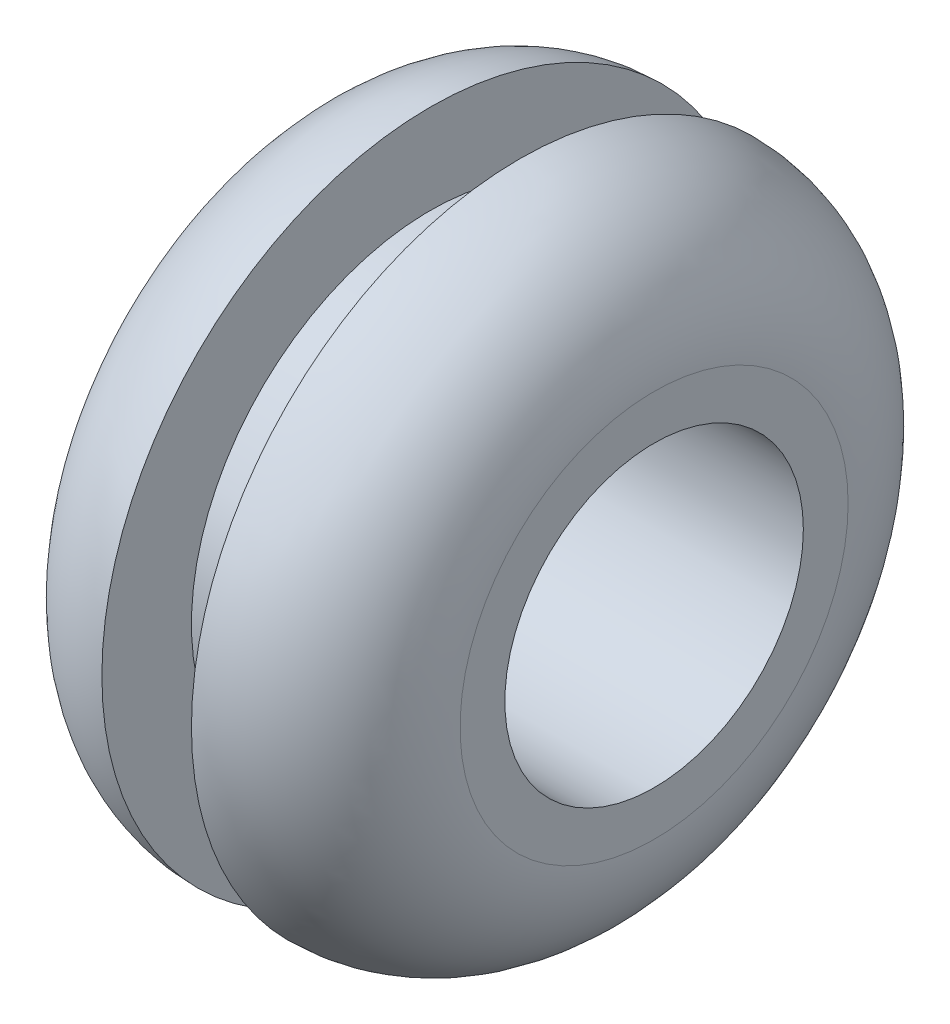
ISO-10303-21;
HEADER;
FILE_DESCRIPTION(('STEP AP214'),'2;1');
FILE_NAME('part.step','',(''),(''),'','','');
FILE_SCHEMA(('AUTOMOTIVE_DESIGN { 1 0 10303 214 1 1 1 1 }'));
ENDSEC;
DATA;
#1=APPLICATION_CONTEXT('core data for automotive mechanical design processes');
#2=APPLICATION_PROTOCOL_DEFINITION('international standard','automotive_design',2000,#1);
#3=PRODUCT_CONTEXT('',#1,'mechanical');
#4=PRODUCT('Part','Part','',(#3));
#5=PRODUCT_RELATED_PRODUCT_CATEGORY('part','',(#4));
#6=PRODUCT_DEFINITION_FORMATION('','',#4);
#7=PRODUCT_DEFINITION_CONTEXT('part definition',#1,'design');
#8=PRODUCT_DEFINITION('design','',#6,#7);
#9=PRODUCT_DEFINITION_SHAPE('','',#8);
#10=(LENGTH_UNIT() NAMED_UNIT(*) SI_UNIT(.MILLI.,.METRE.));
#11=(NAMED_UNIT(*) PLANE_ANGLE_UNIT() SI_UNIT($,.RADIAN.));
#12=(NAMED_UNIT(*) SI_UNIT($,.STERADIAN.) SOLID_ANGLE_UNIT());
#13=UNCERTAINTY_MEASURE_WITH_UNIT(LENGTH_MEASURE(1.E-05),#10,'distance_accuracy_value','');
#14=(GEOMETRIC_REPRESENTATION_CONTEXT(3) GLOBAL_UNCERTAINTY_ASSIGNED_CONTEXT((#13)) GLOBAL_UNIT_ASSIGNED_CONTEXT((#10,
#11,#12)) REPRESENTATION_CONTEXT('',''));
#15=CARTESIAN_POINT('',(0.,0.,0.));
#16=DIRECTION('',(0.,0.,1.));
#17=DIRECTION('',(1.,0.,0.));
#18=AXIS2_PLACEMENT_3D('',#15,#16,#17);
#19=CARTESIAN_POINT('',(-27.9934163169552,5.49999999999999,0.));
#20=DIRECTION('',(-1.,0.,0.));
#21=DIRECTION('',(0.,0.,1.));
#22=AXIS2_PLACEMENT_3D('',#19,#20,#21);
#23=PLANE('',#22);
#24=CARTESIAN_POINT('',(-27.9934163169552,0.,0.));
#25=DIRECTION('',(-1.,0.,0.));
#26=DIRECTION('',(0.,0.,1.));
#27=AXIS2_PLACEMENT_3D('',#24,#25,#26);
#28=CIRCLE('',#27,3.24999999999999);
#29=CARTESIAN_POINT('',(-27.9934163169552,0.,3.24999999999999));
#30=VERTEX_POINT('',#29);
#31=EDGE_CURVE('E10',#30,#30,#28,.T.);
#32=ORIENTED_EDGE('',*,*,#31,.T.);
#33=EDGE_LOOP('',(#32));
#34=FACE_BOUND('',#33,.T.);
#35=CARTESIAN_POINT('',(-27.9934163169552,0.,0.));
#36=DIRECTION('',(1.,0.,0.));
#37=DIRECTION('',(0.,0.,-1.));
#38=AXIS2_PLACEMENT_3D('',#35,#36,#37);
#39=CIRCLE('',#38,2.49999999999999);
#40=CARTESIAN_POINT('',(-27.9934163169552,0.,-2.49999999999999));
#41=VERTEX_POINT('',#40);
#42=EDGE_CURVE('E41',#41,#41,#39,.T.);
#43=ORIENTED_EDGE('',*,*,#42,.T.);
#44=EDGE_LOOP('',(#43));
#45=FACE_BOUND('',#44,.T.);
#46=ADVANCED_FACE('F30',(#34,#45),#23,.T.);
#47=CARTESIAN_POINT('',(24.6068051669873,0.,0.));
#48=DIRECTION('',(1.,0.,0.));
#49=DIRECTION('',(0.,0.,-1.));
#50=AXIS2_PLACEMENT_3D('',#47,#48,#49);
#51=CYLINDRICAL_SURFACE('',#50,2.49999999999999);
#52=CARTESIAN_POINT('',(-21.9934163169552,0.,0.));
#53=DIRECTION('',(1.,0.,0.));
#54=DIRECTION('',(0.,0.,-1.));
#55=AXIS2_PLACEMENT_3D('',#52,#53,#54);
#56=CIRCLE('',#55,2.49999999999999);
#57=CARTESIAN_POINT('',(-21.9934163169552,0.,-2.49999999999999));
#58=VERTEX_POINT('',#57);
#59=EDGE_CURVE('E45',#58,#58,#56,.T.);
#60=ORIENTED_EDGE('',*,*,#59,.T.);
#61=EDGE_LOOP('',(#60));
#62=FACE_BOUND('',#61,.T.);
#63=ORIENTED_EDGE('',*,*,#42,.F.);
#64=EDGE_LOOP('',(#63));
#65=FACE_BOUND('',#64,.T.);
#66=ADVANCED_FACE('F74',(#62,#65),#51,.F.);
#67=CARTESIAN_POINT('',(-21.9934163169552,2.49999999999999,0.));
#68=DIRECTION('',(1.,0.,0.));
#69=DIRECTION('',(0.,0.,-1.));
#70=AXIS2_PLACEMENT_3D('',#67,#68,#69);
#71=PLANE('',#70);
#72=CARTESIAN_POINT('',(-21.9934163169552,0.,0.));
#73=DIRECTION('',(1.,0.,0.));
#74=DIRECTION('',(0.,0.,-1.));
#75=AXIS2_PLACEMENT_3D('',#72,#73,#74);
#76=CIRCLE('',#75,3.25);
#77=CARTESIAN_POINT('',(-21.9934163169552,0.,-3.25));
#78=VERTEX_POINT('',#77);
#79=EDGE_CURVE('E37',#78,#78,#76,.T.);
#80=ORIENTED_EDGE('',*,*,#79,.T.);
#81=EDGE_LOOP('',(#80));
#82=FACE_BOUND('',#81,.T.);
#83=ORIENTED_EDGE('',*,*,#59,.F.);
#84=EDGE_LOOP('',(#83));
#85=FACE_BOUND('',#84,.T.);
#86=ADVANCED_FACE('F79',(#82,#85),#71,.T.);
#87=CARTESIAN_POINT('',(-24.2434163169552,5.5,0.));
#88=DIRECTION('',(-1.,0.,0.));
#89=DIRECTION('',(0.,0.,1.));
#90=AXIS2_PLACEMENT_3D('',#87,#88,#89);
#91=PLANE('',#90);
#92=CARTESIAN_POINT('',(-24.2434163169552,0.,0.));
#93=DIRECTION('',(1.,0.,0.));
#94=DIRECTION('',(0.,0.,-1.));
#95=AXIS2_PLACEMENT_3D('',#92,#93,#94);
#96=CIRCLE('',#95,3.99999999999999);
#97=CARTESIAN_POINT('',(-24.2434163169552,0.,-3.99999999999999));
#98=VERTEX_POINT('',#97);
#99=EDGE_CURVE('E53',#98,#98,#96,.T.);
#100=ORIENTED_EDGE('',*,*,#99,.T.);
#101=EDGE_LOOP('',(#100));
#102=FACE_BOUND('',#101,.T.);
#103=CARTESIAN_POINT('',(-24.2434163169552,0.,0.));
#104=DIRECTION('',(1.,0.,0.));
#105=DIRECTION('',(0.,0.,-1.));
#106=AXIS2_PLACEMENT_3D('',#103,#104,#105);
#107=CIRCLE('',#106,5.5);
#108=CARTESIAN_POINT('',(-24.2434163169552,0.,-5.5));
#109=VERTEX_POINT('',#108);
#110=EDGE_CURVE('E50',#109,#109,#107,.T.);
#111=ORIENTED_EDGE('',*,*,#110,.F.);
#112=EDGE_LOOP('',(#111));
#113=FACE_BOUND('',#112,.T.);
#114=ADVANCED_FACE('F86',(#102,#113),#91,.T.);
#115=CARTESIAN_POINT('',(24.6068051669873,0.,0.));
#116=DIRECTION('',(1.,0.,0.));
#117=DIRECTION('',(0.,0.,-1.));
#118=AXIS2_PLACEMENT_3D('',#115,#116,#117);
#119=CYLINDRICAL_SURFACE('',#118,3.99999999999999);
#120=CARTESIAN_POINT('',(-25.7434163169552,0.,0.));
#121=DIRECTION('',(1.,0.,0.));
#122=DIRECTION('',(0.,0.,-1.));
#123=AXIS2_PLACEMENT_3D('',#120,#121,#122);
#124=CIRCLE('',#123,3.99999999999999);
#125=CARTESIAN_POINT('',(-25.7434163169552,0.,-3.99999999999999));
#126=VERTEX_POINT('',#125);
#127=EDGE_CURVE('E56',#126,#126,#124,.T.);
#128=ORIENTED_EDGE('',*,*,#127,.T.);
#129=EDGE_LOOP('',(#128));
#130=FACE_BOUND('',#129,.T.);
#131=ORIENTED_EDGE('',*,*,#99,.F.);
#132=EDGE_LOOP('',(#131));
#133=FACE_BOUND('',#132,.T.);
#134=ADVANCED_FACE('F89',(#130,#133),#119,.T.);
#135=CARTESIAN_POINT('',(-25.7434163169552,3.99999999999999,0.));
#136=DIRECTION('',(1.,0.,0.));
#137=DIRECTION('',(0.,0.,-1.));
#138=AXIS2_PLACEMENT_3D('',#135,#136,#137);
#139=PLANE('',#138);
#140=CARTESIAN_POINT('',(-25.7434163169552,0.,0.));
#141=DIRECTION('',(1.,0.,0.));
#142=DIRECTION('',(0.,0.,-1.));
#143=AXIS2_PLACEMENT_3D('',#140,#141,#142);
#144=CIRCLE('',#143,5.49999999999999);
#145=CARTESIAN_POINT('',(-25.7434163169552,0.,-5.49999999999999));
#146=VERTEX_POINT('',#145);
#147=EDGE_CURVE('E59',#146,#146,#144,.T.);
#148=ORIENTED_EDGE('',*,*,#147,.T.);
#149=EDGE_LOOP('',(#148));
#150=FACE_BOUND('',#149,.T.);
#151=ORIENTED_EDGE('',*,*,#127,.F.);
#152=EDGE_LOOP('',(#151));
#153=FACE_BOUND('',#152,.T.);
#154=ADVANCED_FACE('F63',(#150,#153),#139,.T.);
#155=CARTESIAN_POINT('',(-24.2434163169552,0.,0.));
#156=DIRECTION('',(1.,0.,0.));
#157=DIRECTION('',(0.,0.,-1.));
#158=AXIS2_PLACEMENT_3D('',#155,#156,#157);
#159=TOROIDAL_SURFACE('',#158,3.25,2.25);
#160=ORIENTED_EDGE('',*,*,#110,.T.);
#161=EDGE_LOOP('',(#160));
#162=FACE_BOUND('',#161,.T.);
#163=ORIENTED_EDGE('',*,*,#79,.F.);
#164=EDGE_LOOP('',(#163));
#165=FACE_BOUND('',#164,.T.);
#166=ADVANCED_FACE('F67',(#162,#165),#159,.T.);
#167=CARTESIAN_POINT('',(-25.7434163169552,0.,0.));
#168=DIRECTION('',(-1.,0.,0.));
#169=DIRECTION('',(0.,0.,1.));
#170=AXIS2_PLACEMENT_3D('',#167,#168,#169);
#171=TOROIDAL_SURFACE('',#170,3.24999999999999,2.25);
#172=ORIENTED_EDGE('',*,*,#31,.F.);
#173=EDGE_LOOP('',(#172));
#174=FACE_BOUND('',#173,.T.);
#175=ORIENTED_EDGE('',*,*,#147,.F.);
#176=EDGE_LOOP('',(#175));
#177=FACE_BOUND('',#176,.T.);
#178=ADVANCED_FACE('F32',(#174,#177),#171,.T.);
#179=CLOSED_SHELL('',(#46,#66,#86,#114,#134,#154,#166,#178));
#180=MANIFOLD_SOLID_BREP('B2',#179);
#181=ADVANCED_BREP_SHAPE_REPRESENTATION('',(#18,#180),#14);
#182=SHAPE_DEFINITION_REPRESENTATION(#9,#181);
ENDSEC;
END-ISO-10303-21;
